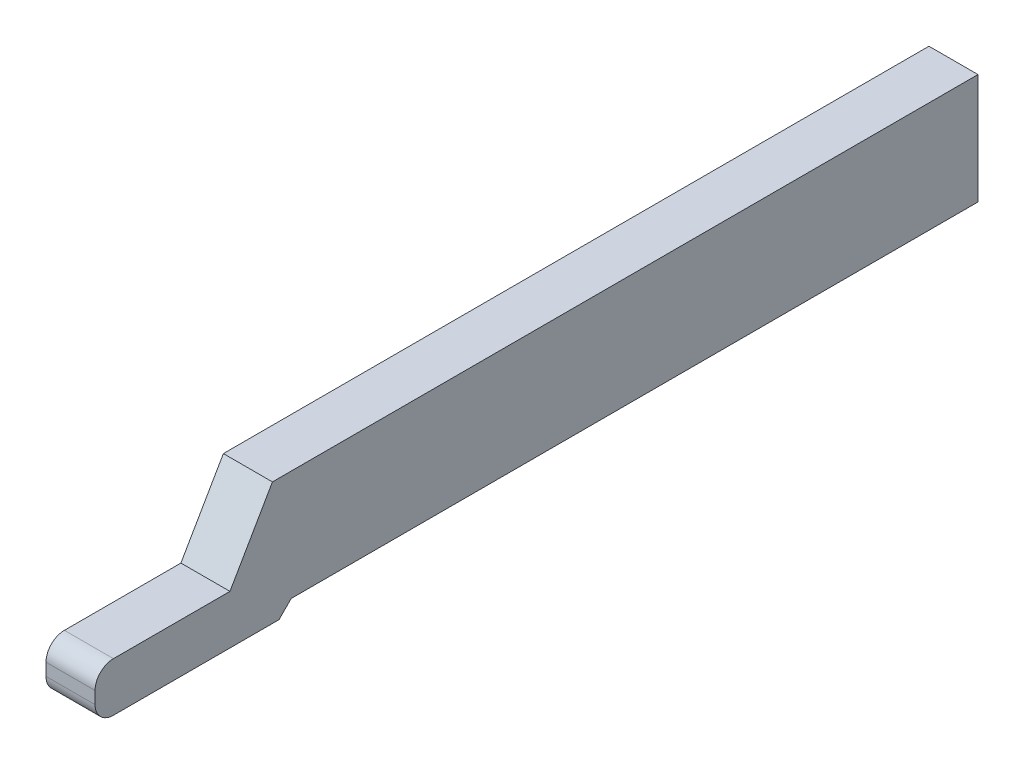
ISO-10303-21;
HEADER;
FILE_DESCRIPTION(('STEP AP214'),'2;1');
FILE_NAME('part.step','',(''),(''),'','','');
FILE_SCHEMA(('AUTOMOTIVE_DESIGN { 1 0 10303 214 1 1 1 1 }'));
ENDSEC;
DATA;
#1=APPLICATION_CONTEXT('core data for automotive mechanical design processes');
#2=APPLICATION_PROTOCOL_DEFINITION('international standard','automotive_design',2000,#1);
#3=PRODUCT_CONTEXT('',#1,'mechanical');
#4=PRODUCT('Part','Part','',(#3));
#5=PRODUCT_RELATED_PRODUCT_CATEGORY('part','',(#4));
#6=PRODUCT_DEFINITION_FORMATION('','',#4);
#7=PRODUCT_DEFINITION_CONTEXT('part definition',#1,'design');
#8=PRODUCT_DEFINITION('design','',#6,#7);
#9=PRODUCT_DEFINITION_SHAPE('','',#8);
#10=(LENGTH_UNIT() NAMED_UNIT(*) SI_UNIT(.MILLI.,.METRE.));
#11=(NAMED_UNIT(*) PLANE_ANGLE_UNIT() SI_UNIT($,.RADIAN.));
#12=(NAMED_UNIT(*) SI_UNIT($,.STERADIAN.) SOLID_ANGLE_UNIT());
#13=UNCERTAINTY_MEASURE_WITH_UNIT(LENGTH_MEASURE(1.E-05),#10,'distance_accuracy_value','');
#14=(GEOMETRIC_REPRESENTATION_CONTEXT(3) GLOBAL_UNCERTAINTY_ASSIGNED_CONTEXT((#13)) GLOBAL_UNIT_ASSIGNED_CONTEXT((#10,
#11,#12)) REPRESENTATION_CONTEXT('',''));
#15=CARTESIAN_POINT('',(0.,0.,0.));
#16=DIRECTION('',(0.,0.,1.));
#17=DIRECTION('',(1.,0.,0.));
#18=AXIS2_PLACEMENT_3D('',#15,#16,#17);
#19=CARTESIAN_POINT('',(-0.6,0.125,3.525));
#20=DIRECTION('',(-1.,0.,0.));
#21=DIRECTION('',(0.,0.,1.));
#22=AXIS2_PLACEMENT_3D('',#19,#20,#21);
#23=PLANE('',#22);
#24=DIRECTION('',(0.,0.707106781186548,-0.707106781186548));
#25=VECTOR('',#24,1.);
#26=CARTESIAN_POINT('',(-0.6,0.,2.85));
#27=LINE('',#26,#25);
#28=CARTESIAN_POINT('',(-0.6,0.,2.85));
#29=VERTEX_POINT('',#28);
#30=CARTESIAN_POINT('',(-0.6,0.05,2.8));
#31=VERTEX_POINT('',#30);
#32=EDGE_CURVE('E182',#29,#31,#27,.T.);
#33=ORIENTED_EDGE('',*,*,#32,.F.);
#34=DIRECTION('',(0.,0.,-1.));
#35=VECTOR('',#34,1.);
#36=CARTESIAN_POINT('',(-0.6,0.,2.85));
#37=LINE('',#36,#35);
#38=CARTESIAN_POINT('',(-0.6,0.,3.525));
#39=VERTEX_POINT('',#38);
#40=EDGE_CURVE('E27',#39,#29,#37,.T.);
#41=ORIENTED_EDGE('',*,*,#40,.F.);
#42=CARTESIAN_POINT('',(-0.6,0.075,3.525));
#43=DIRECTION('',(1.,0.,0.));
#44=DIRECTION('',(0.,0.,1.));
#45=AXIS2_PLACEMENT_3D('',#42,#43,#44);
#46=CIRCLE('',#45,0.075);
#47=CARTESIAN_POINT('',(-0.6,0.075,3.6));
#48=VERTEX_POINT('',#47);
#49=EDGE_CURVE('E148',#48,#39,#46,.T.);
#50=ORIENTED_EDGE('',*,*,#49,.F.);
#51=DIRECTION('',(0.,-1.,0.));
#52=VECTOR('',#51,1.);
#53=CARTESIAN_POINT('',(-0.6,0.075,3.6));
#54=LINE('',#53,#52);
#55=CARTESIAN_POINT('',(-0.6,0.125,3.6));
#56=VERTEX_POINT('',#55);
#57=EDGE_CURVE('E154',#56,#48,#54,.T.);
#58=ORIENTED_EDGE('',*,*,#57,.F.);
#59=CARTESIAN_POINT('',(-0.6,0.125,3.525));
#60=DIRECTION('',(1.,0.,0.));
#61=DIRECTION('',(0.,0.,1.));
#62=AXIS2_PLACEMENT_3D('',#59,#60,#61);
#63=CIRCLE('',#62,0.075);
#64=CARTESIAN_POINT('',(-0.6,0.2,3.525));
#65=VERTEX_POINT('',#64);
#66=EDGE_CURVE('E136',#65,#56,#63,.T.);
#67=ORIENTED_EDGE('',*,*,#66,.F.);
#68=DIRECTION('',(0.,0.,1.));
#69=VECTOR('',#68,1.);
#70=CARTESIAN_POINT('',(-0.6,0.2,3.525));
#71=LINE('',#70,#69);
#72=CARTESIAN_POINT('',(-0.6,0.2,3.05));
#73=VERTEX_POINT('',#72);
#74=EDGE_CURVE('E104',#73,#65,#71,.T.);
#75=ORIENTED_EDGE('',*,*,#74,.F.);
#76=DIRECTION('',(0.,-0.866025403784329,0.50000000000019));
#77=VECTOR('',#76,1.);
#78=CARTESIAN_POINT('',(-0.6,0.2,3.05));
#79=LINE('',#78,#77);
#80=CARTESIAN_POINT('',(-0.6,0.5,2.876794919243));
#81=VERTEX_POINT('',#80);
#82=EDGE_CURVE('E118',#81,#73,#79,.T.);
#83=ORIENTED_EDGE('',*,*,#82,.F.);
#84=DIRECTION('',(0.,0.,1.));
#85=VECTOR('',#84,1.);
#86=CARTESIAN_POINT('',(-0.6,0.5,2.876794919243));
#87=LINE('',#86,#85);
#88=CARTESIAN_POINT('',(-0.6,0.5,0.));
#89=VERTEX_POINT('',#88);
#90=EDGE_CURVE('E122',#89,#81,#87,.T.);
#91=ORIENTED_EDGE('',*,*,#90,.F.);
#92=DIRECTION('',(0.,1.,0.));
#93=VECTOR('',#92,1.);
#94=CARTESIAN_POINT('',(-0.6,0.05,0.));
#95=LINE('',#94,#93);
#96=CARTESIAN_POINT('',(-0.6,0.05,0.));
#97=VERTEX_POINT('',#96);
#98=EDGE_CURVE('E157',#97,#89,#95,.T.);
#99=ORIENTED_EDGE('',*,*,#98,.F.);
#100=DIRECTION('',(0.,0.,-1.));
#101=VECTOR('',#100,1.);
#102=CARTESIAN_POINT('',(-0.6,0.05,2.8));
#103=LINE('',#102,#101);
#104=EDGE_CURVE('E189',#31,#97,#103,.T.);
#105=ORIENTED_EDGE('',*,*,#104,.F.);
#106=EDGE_LOOP('',(#33,#41,#50,#58,#67,#75,#83,#91,#99,#105));
#107=FACE_BOUND('',#106,.T.);
#108=ADVANCED_FACE('F17',(#107),#23,.T.);
#109=CARTESIAN_POINT('',(-0.4,0.125,3.525));
#110=DIRECTION('',(-1.,0.,0.));
#111=DIRECTION('',(0.,0.,1.));
#112=AXIS2_PLACEMENT_3D('',#109,#110,#111);
#113=PLANE('',#112);
#114=DIRECTION('',(0.,0.707106781186548,-0.707106781186548));
#115=VECTOR('',#114,1.);
#116=CARTESIAN_POINT('',(-0.4,0.,2.85));
#117=LINE('',#116,#115);
#118=CARTESIAN_POINT('',(-0.4,0.,2.85));
#119=VERTEX_POINT('',#118);
#120=CARTESIAN_POINT('',(-0.4,0.05,2.8));
#121=VERTEX_POINT('',#120);
#122=EDGE_CURVE('E181',#119,#121,#117,.T.);
#123=ORIENTED_EDGE('',*,*,#122,.T.);
#124=DIRECTION('',(0.,0.,-1.));
#125=VECTOR('',#124,1.);
#126=CARTESIAN_POINT('',(-0.4,0.05,2.8));
#127=LINE('',#126,#125);
#128=CARTESIAN_POINT('',(-0.4,0.05,0.));
#129=VERTEX_POINT('',#128);
#130=EDGE_CURVE('E162',#121,#129,#127,.T.);
#131=ORIENTED_EDGE('',*,*,#130,.T.);
#132=DIRECTION('',(0.,1.,0.));
#133=VECTOR('',#132,1.);
#134=CARTESIAN_POINT('',(-0.4,0.05,0.));
#135=LINE('',#134,#133);
#136=CARTESIAN_POINT('',(-0.4,0.5,0.));
#137=VERTEX_POINT('',#136);
#138=EDGE_CURVE('E113',#129,#137,#135,.T.);
#139=ORIENTED_EDGE('',*,*,#138,.T.);
#140=DIRECTION('',(0.,0.,1.));
#141=VECTOR('',#140,1.);
#142=CARTESIAN_POINT('',(-0.4,0.5,2.876794919243));
#143=LINE('',#142,#141);
#144=CARTESIAN_POINT('',(-0.4,0.5,2.876794919243));
#145=VERTEX_POINT('',#144);
#146=EDGE_CURVE('E108',#137,#145,#143,.T.);
#147=ORIENTED_EDGE('',*,*,#146,.T.);
#148=DIRECTION('',(0.,-0.866025403784329,0.50000000000019));
#149=VECTOR('',#148,1.);
#150=CARTESIAN_POINT('',(-0.4,0.2,3.05));
#151=LINE('',#150,#149);
#152=CARTESIAN_POINT('',(-0.4,0.2,3.05));
#153=VERTEX_POINT('',#152);
#154=EDGE_CURVE('E92',#145,#153,#151,.T.);
#155=ORIENTED_EDGE('',*,*,#154,.T.);
#156=DIRECTION('',(0.,0.,1.));
#157=VECTOR('',#156,1.);
#158=CARTESIAN_POINT('',(-0.4,0.2,3.525));
#159=LINE('',#158,#157);
#160=CARTESIAN_POINT('',(-0.4,0.2,3.525));
#161=VERTEX_POINT('',#160);
#162=EDGE_CURVE('E141',#153,#161,#159,.T.);
#163=ORIENTED_EDGE('',*,*,#162,.T.);
#164=CARTESIAN_POINT('',(-0.4,0.125,3.525));
#165=DIRECTION('',(1.,0.,0.));
#166=DIRECTION('',(0.,0.,1.));
#167=AXIS2_PLACEMENT_3D('',#164,#165,#166);
#168=CIRCLE('',#167,0.075);
#169=CARTESIAN_POINT('',(-0.4,0.125,3.6));
#170=VERTEX_POINT('',#169);
#171=EDGE_CURVE('E173',#161,#170,#168,.T.);
#172=ORIENTED_EDGE('',*,*,#171,.T.);
#173=DIRECTION('',(0.,-1.,0.));
#174=VECTOR('',#173,1.);
#175=CARTESIAN_POINT('',(-0.4,0.075,3.6));
#176=LINE('',#175,#174);
#177=CARTESIAN_POINT('',(-0.4,0.075,3.6));
#178=VERTEX_POINT('',#177);
#179=EDGE_CURVE('E144',#170,#178,#176,.T.);
#180=ORIENTED_EDGE('',*,*,#179,.T.);
#181=CARTESIAN_POINT('',(-0.4,0.075,3.525));
#182=DIRECTION('',(1.,0.,0.));
#183=DIRECTION('',(0.,0.,1.));
#184=AXIS2_PLACEMENT_3D('',#181,#182,#183);
#185=CIRCLE('',#184,0.075);
#186=CARTESIAN_POINT('',(-0.4,0.,3.525));
#187=VERTEX_POINT('',#186);
#188=EDGE_CURVE('E20',#178,#187,#185,.T.);
#189=ORIENTED_EDGE('',*,*,#188,.T.);
#190=DIRECTION('',(0.,0.,-1.));
#191=VECTOR('',#190,1.);
#192=CARTESIAN_POINT('',(-0.4,0.,2.85));
#193=LINE('',#192,#191);
#194=EDGE_CURVE('E11',#187,#119,#193,.T.);
#195=ORIENTED_EDGE('',*,*,#194,.T.);
#196=EDGE_LOOP('',(#123,#131,#139,#147,#155,#163,#172,#180,#189,#195));
#197=FACE_BOUND('',#196,.T.);
#198=ADVANCED_FACE('F110',(#197),#113,.F.);
#199=CARTESIAN_POINT('',(-0.4,0.,2.85));
#200=DIRECTION('',(0.,1.,0.));
#201=DIRECTION('',(0.,0.,-1.));
#202=AXIS2_PLACEMENT_3D('',#199,#200,#201);
#203=PLANE('',#202);
#204=ORIENTED_EDGE('',*,*,#40,.T.);
#205=DIRECTION('',(-1.,0.,0.));
#206=VECTOR('',#205,1.);
#207=CARTESIAN_POINT('',(-0.4,0.,2.85));
#208=LINE('',#207,#206);
#209=EDGE_CURVE('E192',#119,#29,#208,.T.);
#210=ORIENTED_EDGE('',*,*,#209,.F.);
#211=ORIENTED_EDGE('',*,*,#194,.F.);
#212=DIRECTION('',(-1.,0.,0.));
#213=VECTOR('',#212,1.);
#214=CARTESIAN_POINT('',(-0.4,0.,3.525));
#215=LINE('',#214,#213);
#216=EDGE_CURVE('E177',#187,#39,#215,.T.);
#217=ORIENTED_EDGE('',*,*,#216,.T.);
#218=EDGE_LOOP('',(#204,#210,#211,#217));
#219=FACE_BOUND('',#218,.T.);
#220=ADVANCED_FACE('F263',(#219),#203,.F.);
#221=CARTESIAN_POINT('',(-0.4,0.075,3.525));
#222=DIRECTION('',(-1.,0.,0.));
#223=DIRECTION('',(0.,0.,1.));
#224=AXIS2_PLACEMENT_3D('',#221,#222,#223);
#225=CYLINDRICAL_SURFACE('',#224,0.075);
#226=ORIENTED_EDGE('',*,*,#49,.T.);
#227=ORIENTED_EDGE('',*,*,#216,.F.);
#228=ORIENTED_EDGE('',*,*,#188,.F.);
#229=DIRECTION('',(-1.,0.,0.));
#230=VECTOR('',#229,1.);
#231=CARTESIAN_POINT('',(-0.4,0.075,3.6));
#232=LINE('',#231,#230);
#233=EDGE_CURVE('E149',#178,#48,#232,.T.);
#234=ORIENTED_EDGE('',*,*,#233,.T.);
#235=EDGE_LOOP('',(#226,#227,#228,#234));
#236=FACE_BOUND('',#235,.T.);
#237=ADVANCED_FACE('F248',(#236),#225,.T.);
#238=CARTESIAN_POINT('',(-0.4,0.075,3.6));
#239=DIRECTION('',(0.,0.,-1.));
#240=DIRECTION('',(0.,-1.,0.));
#241=AXIS2_PLACEMENT_3D('',#238,#239,#240);
#242=PLANE('',#241);
#243=ORIENTED_EDGE('',*,*,#57,.T.);
#244=ORIENTED_EDGE('',*,*,#233,.F.);
#245=ORIENTED_EDGE('',*,*,#179,.F.);
#246=DIRECTION('',(-1.,0.,0.));
#247=VECTOR('',#246,1.);
#248=CARTESIAN_POINT('',(-0.4,0.125,3.6));
#249=LINE('',#248,#247);
#250=EDGE_CURVE('E140',#170,#56,#249,.T.);
#251=ORIENTED_EDGE('',*,*,#250,.T.);
#252=EDGE_LOOP('',(#243,#244,#245,#251));
#253=FACE_BOUND('',#252,.T.);
#254=ADVANCED_FACE('F237',(#253),#242,.F.);
#255=CARTESIAN_POINT('',(-0.4,0.125,3.525));
#256=DIRECTION('',(-1.,0.,0.));
#257=DIRECTION('',(0.,0.,1.));
#258=AXIS2_PLACEMENT_3D('',#255,#256,#257);
#259=CYLINDRICAL_SURFACE('',#258,0.075);
#260=ORIENTED_EDGE('',*,*,#66,.T.);
#261=ORIENTED_EDGE('',*,*,#250,.F.);
#262=ORIENTED_EDGE('',*,*,#171,.F.);
#263=DIRECTION('',(-1.,0.,0.));
#264=VECTOR('',#263,1.);
#265=CARTESIAN_POINT('',(-0.4,0.2,3.525));
#266=LINE('',#265,#264);
#267=EDGE_CURVE('E135',#161,#65,#266,.T.);
#268=ORIENTED_EDGE('',*,*,#267,.T.);
#269=EDGE_LOOP('',(#260,#261,#262,#268));
#270=FACE_BOUND('',#269,.T.);
#271=ADVANCED_FACE('F228',(#270),#259,.T.);
#272=CARTESIAN_POINT('',(-0.4,0.2,3.525));
#273=DIRECTION('',(0.,-1.,0.));
#274=DIRECTION('',(0.,0.,-1.));
#275=AXIS2_PLACEMENT_3D('',#272,#273,#274);
#276=PLANE('',#275);
#277=ORIENTED_EDGE('',*,*,#74,.T.);
#278=ORIENTED_EDGE('',*,*,#267,.F.);
#279=ORIENTED_EDGE('',*,*,#162,.F.);
#280=DIRECTION('',(-1.,0.,0.));
#281=VECTOR('',#280,1.);
#282=CARTESIAN_POINT('',(-0.4,0.2,3.05));
#283=LINE('',#282,#281);
#284=EDGE_CURVE('E100',#153,#73,#283,.T.);
#285=ORIENTED_EDGE('',*,*,#284,.T.);
#286=EDGE_LOOP('',(#277,#278,#279,#285));
#287=FACE_BOUND('',#286,.T.);
#288=ADVANCED_FACE('F226',(#287),#276,.F.);
#289=CARTESIAN_POINT('',(-0.4,0.2,3.05));
#290=DIRECTION('',(0.,-0.50000000000019,-0.866025403784329));
#291=DIRECTION('',(0.,-0.866025403784329,0.50000000000019));
#292=AXIS2_PLACEMENT_3D('',#289,#290,#291);
#293=PLANE('',#292);
#294=ORIENTED_EDGE('',*,*,#82,.T.);
#295=ORIENTED_EDGE('',*,*,#284,.F.);
#296=ORIENTED_EDGE('',*,*,#154,.F.);
#297=DIRECTION('',(-1.,0.,0.));
#298=VECTOR('',#297,1.);
#299=CARTESIAN_POINT('',(-0.4,0.5,2.876794919243));
#300=LINE('',#299,#298);
#301=EDGE_CURVE('E97',#145,#81,#300,.T.);
#302=ORIENTED_EDGE('',*,*,#301,.T.);
#303=EDGE_LOOP('',(#294,#295,#296,#302));
#304=FACE_BOUND('',#303,.T.);
#305=ADVANCED_FACE('F95',(#304),#293,.F.);
#306=CARTESIAN_POINT('',(-0.4,0.5,2.876794919243));
#307=DIRECTION('',(0.,-1.,0.));
#308=DIRECTION('',(0.,0.,-1.));
#309=AXIS2_PLACEMENT_3D('',#306,#307,#308);
#310=PLANE('',#309);
#311=ORIENTED_EDGE('',*,*,#90,.T.);
#312=ORIENTED_EDGE('',*,*,#301,.F.);
#313=ORIENTED_EDGE('',*,*,#146,.F.);
#314=DIRECTION('',(-1.,0.,0.));
#315=VECTOR('',#314,1.);
#316=CARTESIAN_POINT('',(-0.4,0.5,0.));
#317=LINE('',#316,#315);
#318=EDGE_CURVE('E155',#137,#89,#317,.T.);
#319=ORIENTED_EDGE('',*,*,#318,.T.);
#320=EDGE_LOOP('',(#311,#312,#313,#319));
#321=FACE_BOUND('',#320,.T.);
#322=ADVANCED_FACE('F120',(#321),#310,.F.);
#323=CARTESIAN_POINT('',(-0.4,0.05,0.));
#324=DIRECTION('',(0.,0.,1.));
#325=DIRECTION('',(1.,0.,0.));
#326=AXIS2_PLACEMENT_3D('',#323,#324,#325);
#327=PLANE('',#326);
#328=ORIENTED_EDGE('',*,*,#98,.T.);
#329=ORIENTED_EDGE('',*,*,#318,.F.);
#330=ORIENTED_EDGE('',*,*,#138,.F.);
#331=DIRECTION('',(-1.,0.,0.));
#332=VECTOR('',#331,1.);
#333=CARTESIAN_POINT('',(-0.4,0.05,0.));
#334=LINE('',#333,#332);
#335=EDGE_CURVE('E170',#129,#97,#334,.T.);
#336=ORIENTED_EDGE('',*,*,#335,.T.);
#337=EDGE_LOOP('',(#328,#329,#330,#336));
#338=FACE_BOUND('',#337,.T.);
#339=ADVANCED_FACE('F266',(#338),#327,.F.);
#340=CARTESIAN_POINT('',(-0.4,0.05,2.8));
#341=DIRECTION('',(0.,1.,0.));
#342=DIRECTION('',(1.,0.,0.));
#343=AXIS2_PLACEMENT_3D('',#340,#341,#342);
#344=PLANE('',#343);
#345=ORIENTED_EDGE('',*,*,#104,.T.);
#346=ORIENTED_EDGE('',*,*,#335,.F.);
#347=ORIENTED_EDGE('',*,*,#130,.F.);
#348=DIRECTION('',(-1.,0.,0.));
#349=VECTOR('',#348,1.);
#350=CARTESIAN_POINT('',(-0.4,0.05,2.8));
#351=LINE('',#350,#349);
#352=EDGE_CURVE('E178',#121,#31,#351,.T.);
#353=ORIENTED_EDGE('',*,*,#352,.T.);
#354=EDGE_LOOP('',(#345,#346,#347,#353));
#355=FACE_BOUND('',#354,.T.);
#356=ADVANCED_FACE('F265',(#355),#344,.F.);
#357=CARTESIAN_POINT('',(-0.4,0.,2.85));
#358=DIRECTION('',(0.,0.707106781186548,0.707106781186548));
#359=DIRECTION('',(1.,0.,0.));
#360=AXIS2_PLACEMENT_3D('',#357,#358,#359);
#361=PLANE('',#360);
#362=ORIENTED_EDGE('',*,*,#32,.T.);
#363=ORIENTED_EDGE('',*,*,#352,.F.);
#364=ORIENTED_EDGE('',*,*,#122,.F.);
#365=ORIENTED_EDGE('',*,*,#209,.T.);
#366=EDGE_LOOP('',(#362,#363,#364,#365));
#367=FACE_BOUND('',#366,.T.);
#368=ADVANCED_FACE('F264',(#367),#361,.F.);
#369=CLOSED_SHELL('',(#108,#198,#220,#237,#254,#271,#288,#305,#322,#339,#356,#368));
#370=MANIFOLD_SOLID_BREP('B1',#369);
#371=ADVANCED_BREP_SHAPE_REPRESENTATION('',(#18,#370),#14);
#372=SHAPE_DEFINITION_REPRESENTATION(#9,#371);
ENDSEC;
END-ISO-10303-21;
